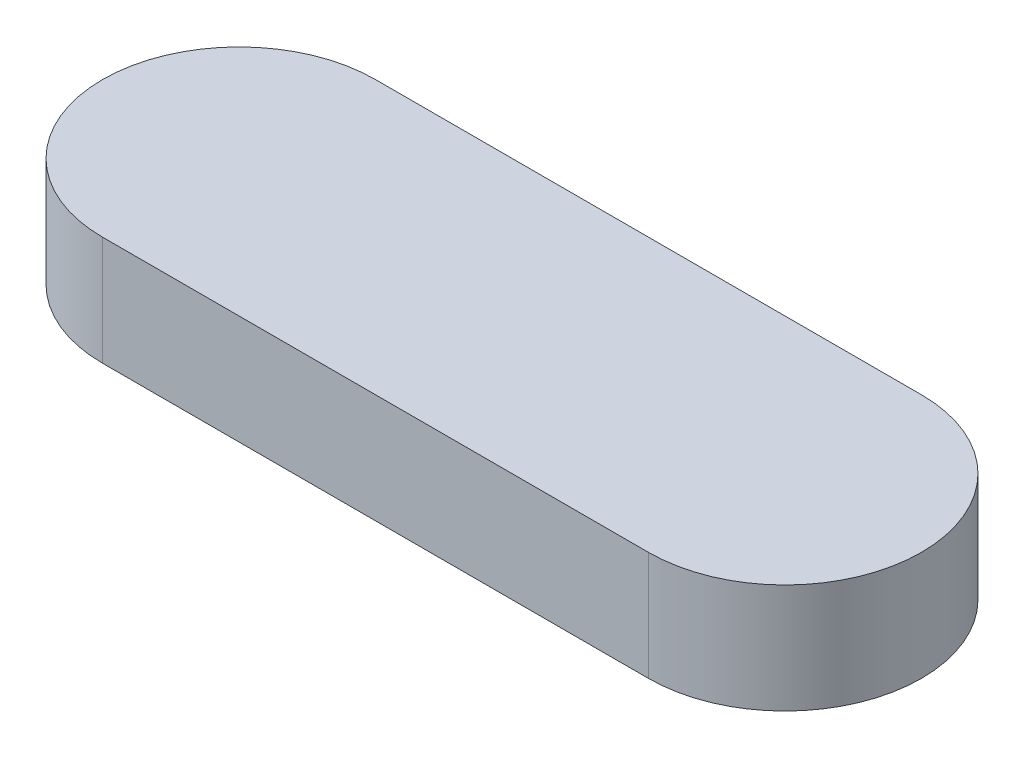
ISO-10303-21;
HEADER;
FILE_DESCRIPTION(('STEP AP214'),'2;1');
FILE_NAME('part.step','',(''),(''),'','','');
FILE_SCHEMA(('AUTOMOTIVE_DESIGN { 1 0 10303 214 1 1 1 1 }'));
ENDSEC;
DATA;
#1=APPLICATION_CONTEXT('core data for automotive mechanical design processes');
#2=APPLICATION_PROTOCOL_DEFINITION('international standard','automotive_design',2000,#1);
#3=PRODUCT_CONTEXT('',#1,'mechanical');
#4=PRODUCT('Part','Part','',(#3));
#5=PRODUCT_RELATED_PRODUCT_CATEGORY('part','',(#4));
#6=PRODUCT_DEFINITION_FORMATION('','',#4);
#7=PRODUCT_DEFINITION_CONTEXT('part definition',#1,'design');
#8=PRODUCT_DEFINITION('design','',#6,#7);
#9=PRODUCT_DEFINITION_SHAPE('','',#8);
#10=(LENGTH_UNIT() NAMED_UNIT(*) SI_UNIT(.MILLI.,.METRE.));
#11=(NAMED_UNIT(*) PLANE_ANGLE_UNIT() SI_UNIT($,.RADIAN.));
#12=(NAMED_UNIT(*) SI_UNIT($,.STERADIAN.) SOLID_ANGLE_UNIT());
#13=UNCERTAINTY_MEASURE_WITH_UNIT(LENGTH_MEASURE(1.E-05),#10,'distance_accuracy_value','');
#14=(GEOMETRIC_REPRESENTATION_CONTEXT(3) GLOBAL_UNCERTAINTY_ASSIGNED_CONTEXT((#13)) GLOBAL_UNIT_ASSIGNED_CONTEXT((#10,
#11,#12)) REPRESENTATION_CONTEXT('',''));
#15=CARTESIAN_POINT('',(0.,0.,0.));
#16=DIRECTION('',(0.,0.,1.));
#17=DIRECTION('',(1.,0.,0.));
#18=AXIS2_PLACEMENT_3D('',#15,#16,#17);
#19=CARTESIAN_POINT('',(-1.15000000000001,28.99,-35.));
#20=DIRECTION('',(0.,0.,-1.));
#21=DIRECTION('',(0.,1.,0.));
#22=AXIS2_PLACEMENT_3D('',#19,#20,#21);
#23=PLANE('',#22);
#24=DIRECTION('',(1.,0.,0.));
#25=VECTOR('',#24,1.);
#26=CARTESIAN_POINT('',(0.,38.,-35.));
#27=LINE('',#26,#25);
#28=CARTESIAN_POINT('',(-1.15000000000001,38.,-35.));
#29=VERTEX_POINT('',#28);
#30=CARTESIAN_POINT('',(8.84999999999999,38.,-35.));
#31=VERTEX_POINT('',#30);
#32=EDGE_CURVE('E103',#29,#31,#27,.T.);
#33=ORIENTED_EDGE('',*,*,#32,.F.);
#34=DIRECTION('',(0.,1.,0.));
#35=VECTOR('',#34,1.);
#36=CARTESIAN_POINT('',(-1.15000000000001,28.99,-35.));
#37=LINE('',#36,#35);
#38=CARTESIAN_POINT('',(-1.15000000000001,40.,-35.));
#39=VERTEX_POINT('',#38);
#40=EDGE_CURVE('E50',#29,#39,#37,.T.);
#41=ORIENTED_EDGE('',*,*,#40,.T.);
#42=DIRECTION('',(-1.,0.,0.));
#43=VECTOR('',#42,1.);
#44=CARTESIAN_POINT('',(-1.15000000000001,40.,-35.));
#45=LINE('',#44,#43);
#46=CARTESIAN_POINT('',(8.84999999999999,40.,-35.));
#47=VERTEX_POINT('',#46);
#48=EDGE_CURVE('E93',#47,#39,#45,.T.);
#49=ORIENTED_EDGE('',*,*,#48,.F.);
#50=DIRECTION('',(0.,1.,0.));
#51=VECTOR('',#50,1.);
#52=CARTESIAN_POINT('',(8.84999999999999,28.99,-35.));
#53=LINE('',#52,#51);
#54=EDGE_CURVE('E11',#31,#47,#53,.T.);
#55=ORIENTED_EDGE('',*,*,#54,.F.);
#56=EDGE_LOOP('',(#33,#41,#49,#55));
#57=FACE_BOUND('',#56,.T.);
#58=ADVANCED_FACE('F41',(#57),#23,.T.);
#59=CARTESIAN_POINT('',(-1.15000000000001,28.99,-32.5));
#60=DIRECTION('',(0.,1.,0.));
#61=DIRECTION('',(1.,0.,0.));
#62=AXIS2_PLACEMENT_3D('',#59,#60,#61);
#63=CYLINDRICAL_SURFACE('',#62,2.5);
#64=CARTESIAN_POINT('',(-1.15000000000001,38.,-32.5));
#65=DIRECTION('',(0.,-1.,0.));
#66=DIRECTION('',(-1.,0.,0.));
#67=AXIS2_PLACEMENT_3D('',#64,#65,#66);
#68=CIRCLE('',#67,2.5);
#69=CARTESIAN_POINT('',(-1.15000000000001,38.,-30.));
#70=VERTEX_POINT('',#69);
#71=EDGE_CURVE('E45',#70,#29,#68,.T.);
#72=ORIENTED_EDGE('',*,*,#71,.F.);
#73=DIRECTION('',(0.,1.,0.));
#74=VECTOR('',#73,1.);
#75=CARTESIAN_POINT('',(-1.15000000000001,28.99,-30.));
#76=LINE('',#75,#74);
#77=CARTESIAN_POINT('',(-1.15000000000001,40.,-30.));
#78=VERTEX_POINT('',#77);
#79=EDGE_CURVE('E82',#70,#78,#76,.T.);
#80=ORIENTED_EDGE('',*,*,#79,.T.);
#81=CARTESIAN_POINT('',(-1.15000000000001,40.,-32.5));
#82=DIRECTION('',(0.,1.,0.));
#83=DIRECTION('',(1.,0.,0.));
#84=AXIS2_PLACEMENT_3D('',#81,#82,#83);
#85=CIRCLE('',#84,2.5);
#86=EDGE_CURVE('E101',#39,#78,#85,.T.);
#87=ORIENTED_EDGE('',*,*,#86,.F.);
#88=ORIENTED_EDGE('',*,*,#40,.F.);
#89=EDGE_LOOP('',(#72,#80,#87,#88));
#90=FACE_BOUND('',#89,.T.);
#91=ADVANCED_FACE('F100',(#90),#63,.T.);
#92=CARTESIAN_POINT('',(8.84999999999999,28.99,-32.5));
#93=DIRECTION('',(0.,1.,0.));
#94=DIRECTION('',(1.,0.,0.));
#95=AXIS2_PLACEMENT_3D('',#92,#93,#94);
#96=CYLINDRICAL_SURFACE('',#95,2.49999999999999);
#97=CARTESIAN_POINT('',(8.84999999999999,38.,-32.5));
#98=DIRECTION('',(0.,-1.,0.));
#99=DIRECTION('',(-1.,0.,0.));
#100=AXIS2_PLACEMENT_3D('',#97,#98,#99);
#101=CIRCLE('',#100,2.49999999999999);
#102=CARTESIAN_POINT('',(8.84999999999999,38.,-30.));
#103=VERTEX_POINT('',#102);
#104=EDGE_CURVE('E99',#31,#103,#101,.T.);
#105=ORIENTED_EDGE('',*,*,#104,.F.);
#106=ORIENTED_EDGE('',*,*,#54,.T.);
#107=CARTESIAN_POINT('',(8.84999999999999,40.,-32.5));
#108=DIRECTION('',(0.,1.,0.));
#109=DIRECTION('',(1.,0.,0.));
#110=AXIS2_PLACEMENT_3D('',#107,#108,#109);
#111=CIRCLE('',#110,2.49999999999999);
#112=CARTESIAN_POINT('',(8.84999999999999,40.,-30.));
#113=VERTEX_POINT('',#112);
#114=EDGE_CURVE('E109',#113,#47,#111,.T.);
#115=ORIENTED_EDGE('',*,*,#114,.F.);
#116=DIRECTION('',(0.,1.,0.));
#117=VECTOR('',#116,1.);
#118=CARTESIAN_POINT('',(8.84999999999999,28.99,-30.));
#119=LINE('',#118,#117);
#120=EDGE_CURVE('E92',#103,#113,#119,.T.);
#121=ORIENTED_EDGE('',*,*,#120,.F.);
#122=EDGE_LOOP('',(#105,#106,#115,#121));
#123=FACE_BOUND('',#122,.T.);
#124=ADVANCED_FACE('F113',(#123),#96,.T.);
#125=CARTESIAN_POINT('',(-1.15000000000001,28.99,-30.));
#126=DIRECTION('',(0.,0.,1.));
#127=DIRECTION('',(1.,0.,0.));
#128=AXIS2_PLACEMENT_3D('',#125,#126,#127);
#129=PLANE('',#128);
#130=DIRECTION('',(-1.,0.,0.));
#131=VECTOR('',#130,1.);
#132=CARTESIAN_POINT('',(0.,38.,-30.));
#133=LINE('',#132,#131);
#134=EDGE_CURVE('E85',#103,#70,#133,.T.);
#135=ORIENTED_EDGE('',*,*,#134,.F.);
#136=ORIENTED_EDGE('',*,*,#120,.T.);
#137=DIRECTION('',(1.,0.,0.));
#138=VECTOR('',#137,1.);
#139=CARTESIAN_POINT('',(-1.15000000000001,40.,-30.));
#140=LINE('',#139,#138);
#141=EDGE_CURVE('E87',#78,#113,#140,.T.);
#142=ORIENTED_EDGE('',*,*,#141,.F.);
#143=ORIENTED_EDGE('',*,*,#79,.F.);
#144=EDGE_LOOP('',(#135,#136,#142,#143));
#145=FACE_BOUND('',#144,.T.);
#146=ADVANCED_FACE('F84',(#145),#129,.T.);
#147=CARTESIAN_POINT('',(0.,40.,0.));
#148=DIRECTION('',(0.,-1.,0.));
#149=DIRECTION('',(-1.,0.,0.));
#150=AXIS2_PLACEMENT_3D('',#147,#148,#149);
#151=PLANE('',#150);
#152=ORIENTED_EDGE('',*,*,#48,.T.);
#153=ORIENTED_EDGE('',*,*,#86,.T.);
#154=ORIENTED_EDGE('',*,*,#141,.T.);
#155=ORIENTED_EDGE('',*,*,#114,.T.);
#156=EDGE_LOOP('',(#152,#153,#154,#155));
#157=FACE_BOUND('',#156,.T.);
#158=ADVANCED_FACE('F115',(#157),#151,.F.);
#159=CARTESIAN_POINT('',(0.,38.,0.));
#160=DIRECTION('',(0.,-1.,0.));
#161=DIRECTION('',(-1.,0.,0.));
#162=AXIS2_PLACEMENT_3D('',#159,#160,#161);
#163=PLANE('',#162);
#164=ORIENTED_EDGE('',*,*,#134,.T.);
#165=ORIENTED_EDGE('',*,*,#71,.T.);
#166=ORIENTED_EDGE('',*,*,#32,.T.);
#167=ORIENTED_EDGE('',*,*,#104,.T.);
#168=EDGE_LOOP('',(#164,#165,#166,#167));
#169=FACE_BOUND('',#168,.T.);
#170=ADVANCED_FACE('F43',(#169),#163,.T.);
#171=CLOSED_SHELL('',(#58,#91,#124,#146,#158,#170));
#172=MANIFOLD_SOLID_BREP('B2',#171);
#173=ADVANCED_BREP_SHAPE_REPRESENTATION('',(#18,#172),#14);
#174=SHAPE_DEFINITION_REPRESENTATION(#9,#173);
ENDSEC;
END-ISO-10303-21;
